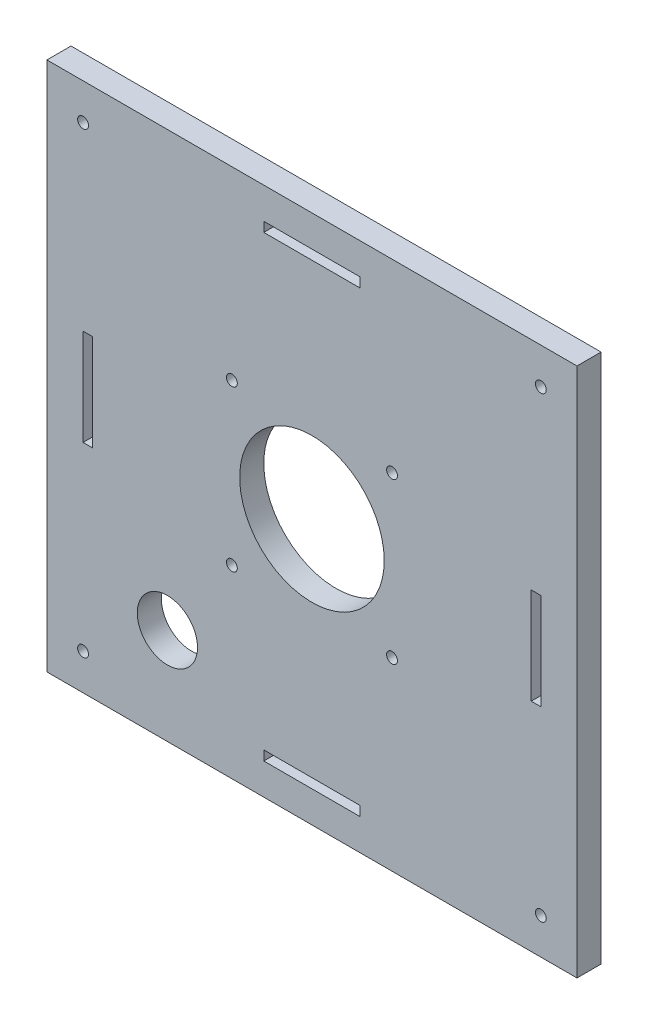
ISO-10303-21;
HEADER;
FILE_DESCRIPTION(('STEP AP214'),'2;1');
FILE_NAME('part.step','',(''),(''),'','','');
FILE_SCHEMA(('AUTOMOTIVE_DESIGN { 1 0 10303 214 1 1 1 1 }'));
ENDSEC;
DATA;
#1=APPLICATION_CONTEXT('core data for automotive mechanical design processes');
#2=APPLICATION_PROTOCOL_DEFINITION('international standard','automotive_design',2000,#1);
#3=PRODUCT_CONTEXT('',#1,'mechanical');
#4=PRODUCT('Part','Part','',(#3));
#5=PRODUCT_RELATED_PRODUCT_CATEGORY('part','',(#4));
#6=PRODUCT_DEFINITION_FORMATION('','',#4);
#7=PRODUCT_DEFINITION_CONTEXT('part definition',#1,'design');
#8=PRODUCT_DEFINITION('design','',#6,#7);
#9=PRODUCT_DEFINITION_SHAPE('','',#8);
#10=(LENGTH_UNIT() NAMED_UNIT(*) SI_UNIT(.MILLI.,.METRE.));
#11=(NAMED_UNIT(*) PLANE_ANGLE_UNIT() SI_UNIT($,.RADIAN.));
#12=(NAMED_UNIT(*) SI_UNIT($,.STERADIAN.) SOLID_ANGLE_UNIT());
#13=UNCERTAINTY_MEASURE_WITH_UNIT(LENGTH_MEASURE(1.E-05),#10,'distance_accuracy_value','');
#14=(GEOMETRIC_REPRESENTATION_CONTEXT(3) GLOBAL_UNCERTAINTY_ASSIGNED_CONTEXT((#13)) GLOBAL_UNIT_ASSIGNED_CONTEXT((#10,
#11,#12)) REPRESENTATION_CONTEXT('',''));
#15=CARTESIAN_POINT('',(0.,0.,0.));
#16=DIRECTION('',(0.,0.,1.));
#17=DIRECTION('',(1.,0.,0.));
#18=AXIS2_PLACEMENT_3D('',#15,#16,#17);
#19=CARTESIAN_POINT('',(110.,-110.,10.));
#20=DIRECTION('',(-1.,0.,0.));
#21=DIRECTION('',(0.,0.,1.));
#22=AXIS2_PLACEMENT_3D('',#19,#20,#21);
#23=PLANE('',#22);
#24=DIRECTION('',(0.,1.,0.));
#25=VECTOR('',#24,1.);
#26=CARTESIAN_POINT('',(110.,-110.,0.));
#27=LINE('',#26,#25);
#28=CARTESIAN_POINT('',(110.,-110.,0.));
#29=VERTEX_POINT('',#28);
#30=CARTESIAN_POINT('',(110.,110.,0.));
#31=VERTEX_POINT('',#30);
#32=EDGE_CURVE('E382',#29,#31,#27,.T.);
#33=ORIENTED_EDGE('',*,*,#32,.T.);
#34=DIRECTION('',(0.,0.,-1.));
#35=VECTOR('',#34,1.);
#36=CARTESIAN_POINT('',(110.,110.,10.));
#37=LINE('',#36,#35);
#38=CARTESIAN_POINT('',(110.,110.,10.));
#39=VERTEX_POINT('',#38);
#40=EDGE_CURVE('E11',#39,#31,#37,.T.);
#41=ORIENTED_EDGE('',*,*,#40,.F.);
#42=DIRECTION('',(0.,1.,0.));
#43=VECTOR('',#42,1.);
#44=CARTESIAN_POINT('',(110.,-110.,10.));
#45=LINE('',#44,#43);
#46=CARTESIAN_POINT('',(110.,-110.,10.));
#47=VERTEX_POINT('',#46);
#48=EDGE_CURVE('E381',#47,#39,#45,.T.);
#49=ORIENTED_EDGE('',*,*,#48,.F.);
#50=DIRECTION('',(0.,0.,-1.));
#51=VECTOR('',#50,1.);
#52=CARTESIAN_POINT('',(110.,-110.,10.));
#53=LINE('',#52,#51);
#54=EDGE_CURVE('E393',#47,#29,#53,.T.);
#55=ORIENTED_EDGE('',*,*,#54,.T.);
#56=EDGE_LOOP('',(#33,#41,#49,#55));
#57=FACE_BOUND('',#56,.T.);
#58=ADVANCED_FACE('F39',(#57),#23,.F.);
#59=CARTESIAN_POINT('',(-110.,110.,10.));
#60=DIRECTION('',(0.,-1.,0.));
#61=DIRECTION('',(0.,0.,-1.));
#62=AXIS2_PLACEMENT_3D('',#59,#60,#61);
#63=PLANE('',#62);
#64=DIRECTION('',(-1.,0.,0.));
#65=VECTOR('',#64,1.);
#66=CARTESIAN_POINT('',(-110.,110.,0.));
#67=LINE('',#66,#65);
#68=CARTESIAN_POINT('',(-110.,110.,0.));
#69=VERTEX_POINT('',#68);
#70=EDGE_CURVE('E397',#31,#69,#67,.T.);
#71=ORIENTED_EDGE('',*,*,#70,.T.);
#72=DIRECTION('',(0.,0.,-1.));
#73=VECTOR('',#72,1.);
#74=CARTESIAN_POINT('',(-110.,110.,10.));
#75=LINE('',#74,#73);
#76=CARTESIAN_POINT('',(-110.,110.,10.));
#77=VERTEX_POINT('',#76);
#78=EDGE_CURVE('E50',#77,#69,#75,.T.);
#79=ORIENTED_EDGE('',*,*,#78,.F.);
#80=DIRECTION('',(-1.,0.,0.));
#81=VECTOR('',#80,1.);
#82=CARTESIAN_POINT('',(-110.,110.,10.));
#83=LINE('',#82,#81);
#84=EDGE_CURVE('E386',#39,#77,#83,.T.);
#85=ORIENTED_EDGE('',*,*,#84,.F.);
#86=ORIENTED_EDGE('',*,*,#40,.T.);
#87=EDGE_LOOP('',(#71,#79,#85,#86));
#88=FACE_BOUND('',#87,.T.);
#89=ADVANCED_FACE('F450',(#88),#63,.F.);
#90=CARTESIAN_POINT('',(-110.,-110.,10.));
#91=DIRECTION('',(1.,0.,0.));
#92=DIRECTION('',(0.,0.,-1.));
#93=AXIS2_PLACEMENT_3D('',#90,#91,#92);
#94=PLANE('',#93);
#95=DIRECTION('',(0.,-1.,0.));
#96=VECTOR('',#95,1.);
#97=CARTESIAN_POINT('',(-110.,-110.,0.));
#98=LINE('',#97,#96);
#99=CARTESIAN_POINT('',(-110.,-110.,0.));
#100=VERTEX_POINT('',#99);
#101=EDGE_CURVE('E398',#69,#100,#98,.T.);
#102=ORIENTED_EDGE('',*,*,#101,.T.);
#103=DIRECTION('',(0.,0.,-1.));
#104=VECTOR('',#103,1.);
#105=CARTESIAN_POINT('',(-110.,-110.,10.));
#106=LINE('',#105,#104);
#107=CARTESIAN_POINT('',(-110.,-110.,10.));
#108=VERTEX_POINT('',#107);
#109=EDGE_CURVE('E404',#108,#100,#106,.T.);
#110=ORIENTED_EDGE('',*,*,#109,.F.);
#111=DIRECTION('',(0.,-1.,0.));
#112=VECTOR('',#111,1.);
#113=CARTESIAN_POINT('',(-110.,-110.,10.));
#114=LINE('',#113,#112);
#115=EDGE_CURVE('E387',#77,#108,#114,.T.);
#116=ORIENTED_EDGE('',*,*,#115,.F.);
#117=ORIENTED_EDGE('',*,*,#78,.T.);
#118=EDGE_LOOP('',(#102,#110,#116,#117));
#119=FACE_BOUND('',#118,.T.);
#120=ADVANCED_FACE('F451',(#119),#94,.F.);
#121=CARTESIAN_POINT('',(-110.,-110.,10.));
#122=DIRECTION('',(0.,1.,0.));
#123=DIRECTION('',(0.,0.,1.));
#124=AXIS2_PLACEMENT_3D('',#121,#122,#123);
#125=PLANE('',#124);
#126=DIRECTION('',(1.,0.,0.));
#127=VECTOR('',#126,1.);
#128=CARTESIAN_POINT('',(-110.,-110.,0.));
#129=LINE('',#128,#127);
#130=EDGE_CURVE('E390',#100,#29,#129,.T.);
#131=ORIENTED_EDGE('',*,*,#130,.T.);
#132=ORIENTED_EDGE('',*,*,#54,.F.);
#133=DIRECTION('',(1.,0.,0.));
#134=VECTOR('',#133,1.);
#135=CARTESIAN_POINT('',(-110.,-110.,10.));
#136=LINE('',#135,#134);
#137=EDGE_CURVE('E391',#108,#47,#136,.T.);
#138=ORIENTED_EDGE('',*,*,#137,.F.);
#139=ORIENTED_EDGE('',*,*,#109,.T.);
#140=EDGE_LOOP('',(#131,#132,#138,#139));
#141=FACE_BOUND('',#140,.T.);
#142=ADVANCED_FACE('F432',(#141),#125,.F.);
#143=CARTESIAN_POINT('',(0.,0.,10.));
#144=DIRECTION('',(0.,0.,-1.));
#145=DIRECTION('',(-1.,0.,0.));
#146=AXIS2_PLACEMENT_3D('',#143,#144,#145);
#147=PLANE('',#146);
#148=DIRECTION('',(-1.,0.,0.));
#149=VECTOR('',#148,1.);
#150=CARTESIAN_POINT('',(-20.0000000000002,-93.,10.));
#151=LINE('',#150,#149);
#152=CARTESIAN_POINT('',(19.9999999999998,-93.,10.));
#153=VERTEX_POINT('',#152);
#154=CARTESIAN_POINT('',(-20.0000000000002,-93.,10.));
#155=VERTEX_POINT('',#154);
#156=EDGE_CURVE('E210',#153,#155,#151,.T.);
#157=ORIENTED_EDGE('',*,*,#156,.F.);
#158=DIRECTION('',(0.,1.,0.));
#159=VECTOR('',#158,1.);
#160=CARTESIAN_POINT('',(19.9999999999998,-97.,10.));
#161=LINE('',#160,#159);
#162=CARTESIAN_POINT('',(19.9999999999998,-97.,10.));
#163=VERTEX_POINT('',#162);
#164=EDGE_CURVE('E54',#163,#153,#161,.T.);
#165=ORIENTED_EDGE('',*,*,#164,.F.);
#166=DIRECTION('',(1.,0.,0.));
#167=VECTOR('',#166,1.);
#168=CARTESIAN_POINT('',(-20.0000000000002,-97.,10.));
#169=LINE('',#168,#167);
#170=CARTESIAN_POINT('',(-20.0000000000002,-97.,10.));
#171=VERTEX_POINT('',#170);
#172=EDGE_CURVE('E200',#171,#163,#169,.T.);
#173=ORIENTED_EDGE('',*,*,#172,.F.);
#174=DIRECTION('',(0.,-1.,0.));
#175=VECTOR('',#174,1.);
#176=CARTESIAN_POINT('',(-20.0000000000002,-97.,10.));
#177=LINE('',#176,#175);
#178=EDGE_CURVE('E201',#155,#171,#177,.T.);
#179=ORIENTED_EDGE('',*,*,#178,.F.);
#180=EDGE_LOOP('',(#157,#165,#173,#179));
#181=FACE_BOUND('',#180,.T.);
#182=DIRECTION('',(0.,-1.,0.));
#183=VECTOR('',#182,1.);
#184=CARTESIAN_POINT('',(-20.0000000000002,97.,10.));
#185=LINE('',#184,#183);
#186=CARTESIAN_POINT('',(-20.0000000000002,97.,10.));
#187=VERTEX_POINT('',#186);
#188=CARTESIAN_POINT('',(-20.0000000000002,93.,10.));
#189=VERTEX_POINT('',#188);
#190=EDGE_CURVE('E234',#187,#189,#185,.T.);
#191=ORIENTED_EDGE('',*,*,#190,.F.);
#192=DIRECTION('',(-1.,0.,0.));
#193=VECTOR('',#192,1.);
#194=CARTESIAN_POINT('',(-20.0000000000002,97.,10.));
#195=LINE('',#194,#193);
#196=CARTESIAN_POINT('',(19.9999999999998,97.,10.));
#197=VERTEX_POINT('',#196);
#198=EDGE_CURVE('E65',#197,#187,#195,.T.);
#199=ORIENTED_EDGE('',*,*,#198,.F.);
#200=DIRECTION('',(0.,1.,0.));
#201=VECTOR('',#200,1.);
#202=CARTESIAN_POINT('',(19.9999999999998,97.,10.));
#203=LINE('',#202,#201);
#204=CARTESIAN_POINT('',(19.9999999999998,93.,10.));
#205=VERTEX_POINT('',#204);
#206=EDGE_CURVE('E227',#205,#197,#203,.T.);
#207=ORIENTED_EDGE('',*,*,#206,.F.);
#208=DIRECTION('',(1.,0.,0.));
#209=VECTOR('',#208,1.);
#210=CARTESIAN_POINT('',(-20.0000000000002,93.,10.));
#211=LINE('',#210,#209);
#212=EDGE_CURVE('E229',#189,#205,#211,.T.);
#213=ORIENTED_EDGE('',*,*,#212,.F.);
#214=EDGE_LOOP('',(#191,#199,#207,#213));
#215=FACE_BOUND('',#214,.T.);
#216=DIRECTION('',(-1.,0.,0.));
#217=VECTOR('',#216,1.);
#218=CARTESIAN_POINT('',(95.,20.0000000000001,10.));
#219=LINE('',#218,#217);
#220=CARTESIAN_POINT('',(95.,20.0000000000001,10.));
#221=VERTEX_POINT('',#220);
#222=CARTESIAN_POINT('',(91.,20.0000000000001,10.));
#223=VERTEX_POINT('',#222);
#224=EDGE_CURVE('E266',#221,#223,#219,.T.);
#225=ORIENTED_EDGE('',*,*,#224,.F.);
#226=DIRECTION('',(0.,1.,0.));
#227=VECTOR('',#226,1.);
#228=CARTESIAN_POINT('',(95.,20.0000000000001,10.));
#229=LINE('',#228,#227);
#230=CARTESIAN_POINT('',(95.,-19.9999999999999,10.));
#231=VERTEX_POINT('',#230);
#232=EDGE_CURVE('E228',#231,#221,#229,.T.);
#233=ORIENTED_EDGE('',*,*,#232,.F.);
#234=DIRECTION('',(1.,0.,0.));
#235=VECTOR('',#234,1.);
#236=CARTESIAN_POINT('',(95.,-19.9999999999999,10.));
#237=LINE('',#236,#235);
#238=CARTESIAN_POINT('',(91.,-19.9999999999999,10.));
#239=VERTEX_POINT('',#238);
#240=EDGE_CURVE('E258',#239,#231,#237,.T.);
#241=ORIENTED_EDGE('',*,*,#240,.F.);
#242=DIRECTION('',(0.,-1.,0.));
#243=VECTOR('',#242,1.);
#244=CARTESIAN_POINT('',(91.,20.0000000000001,10.));
#245=LINE('',#244,#243);
#246=EDGE_CURVE('E261',#223,#239,#245,.T.);
#247=ORIENTED_EDGE('',*,*,#246,.F.);
#248=EDGE_LOOP('',(#225,#233,#241,#247));
#249=FACE_BOUND('',#248,.T.);
#250=DIRECTION('',(-1.,0.,0.));
#251=VECTOR('',#250,1.);
#252=CARTESIAN_POINT('',(-95.,20.0000000000001,10.));
#253=LINE('',#252,#251);
#254=CARTESIAN_POINT('',(-91.,20.0000000000001,10.));
#255=VERTEX_POINT('',#254);
#256=CARTESIAN_POINT('',(-95.,20.0000000000001,10.));
#257=VERTEX_POINT('',#256);
#258=EDGE_CURVE('E300',#255,#257,#253,.T.);
#259=ORIENTED_EDGE('',*,*,#258,.F.);
#260=DIRECTION('',(0.,1.,0.));
#261=VECTOR('',#260,1.);
#262=CARTESIAN_POINT('',(-91.,20.0000000000001,10.));
#263=LINE('',#262,#261);
#264=CARTESIAN_POINT('',(-91.,-19.9999999999999,10.));
#265=VERTEX_POINT('',#264);
#266=EDGE_CURVE('E260',#265,#255,#263,.T.);
#267=ORIENTED_EDGE('',*,*,#266,.F.);
#268=DIRECTION('',(1.,0.,0.));
#269=VECTOR('',#268,1.);
#270=CARTESIAN_POINT('',(-95.,-19.9999999999999,10.));
#271=LINE('',#270,#269);
#272=CARTESIAN_POINT('',(-95.,-19.9999999999999,10.));
#273=VERTEX_POINT('',#272);
#274=EDGE_CURVE('E290',#273,#265,#271,.T.);
#275=ORIENTED_EDGE('',*,*,#274,.F.);
#276=DIRECTION('',(0.,-1.,0.));
#277=VECTOR('',#276,1.);
#278=CARTESIAN_POINT('',(-95.,20.0000000000001,10.));
#279=LINE('',#278,#277);
#280=EDGE_CURVE('E291',#257,#273,#279,.T.);
#281=ORIENTED_EDGE('',*,*,#280,.F.);
#282=EDGE_LOOP('',(#259,#267,#275,#281));
#283=FACE_BOUND('',#282,.T.);
#284=CARTESIAN_POINT('',(-60.,-70.,10.));
#285=DIRECTION('',(0.,0.,1.));
#286=DIRECTION('',(1.,0.,0.));
#287=AXIS2_PLACEMENT_3D('',#284,#285,#286);
#288=CIRCLE('',#287,12.5);
#289=CARTESIAN_POINT('',(-47.5,-70.,10.));
#290=VERTEX_POINT('',#289);
#291=EDGE_CURVE('E311',#290,#290,#288,.T.);
#292=ORIENTED_EDGE('',*,*,#291,.F.);
#293=EDGE_LOOP('',(#292));
#294=FACE_BOUND('',#293,.T.);
#295=CARTESIAN_POINT('',(-95.,95.,10.));
#296=DIRECTION('',(0.,0.,1.));
#297=DIRECTION('',(1.,0.,0.));
#298=AXIS2_PLACEMENT_3D('',#295,#296,#297);
#299=CIRCLE('',#298,2.25);
#300=CARTESIAN_POINT('',(-92.75,95.,10.));
#301=VERTEX_POINT('',#300);
#302=EDGE_CURVE('E326',#301,#301,#299,.T.);
#303=ORIENTED_EDGE('',*,*,#302,.F.);
#304=EDGE_LOOP('',(#303));
#305=FACE_BOUND('',#304,.T.);
#306=CARTESIAN_POINT('',(95.,-95.,10.));
#307=DIRECTION('',(0.,0.,1.));
#308=DIRECTION('',(1.,0.,0.));
#309=AXIS2_PLACEMENT_3D('',#306,#307,#308);
#310=CIRCLE('',#309,2.25);
#311=CARTESIAN_POINT('',(97.25,-95.,10.));
#312=VERTEX_POINT('',#311);
#313=EDGE_CURVE('E318',#312,#312,#310,.T.);
#314=ORIENTED_EDGE('',*,*,#313,.F.);
#315=EDGE_LOOP('',(#314));
#316=FACE_BOUND('',#315,.T.);
#317=CARTESIAN_POINT('',(95.,95.,10.));
#318=DIRECTION('',(0.,0.,1.));
#319=DIRECTION('',(1.,0.,0.));
#320=AXIS2_PLACEMENT_3D('',#317,#318,#319);
#321=CIRCLE('',#320,2.25);
#322=CARTESIAN_POINT('',(97.25,95.,10.));
#323=VERTEX_POINT('',#322);
#324=EDGE_CURVE('E313',#323,#323,#321,.T.);
#325=ORIENTED_EDGE('',*,*,#324,.F.);
#326=EDGE_LOOP('',(#325));
#327=FACE_BOUND('',#326,.T.);
#328=CARTESIAN_POINT('',(-95.,-95.,10.));
#329=DIRECTION('',(0.,0.,1.));
#330=DIRECTION('',(1.,0.,0.));
#331=AXIS2_PLACEMENT_3D('',#328,#329,#330);
#332=CIRCLE('',#331,2.25);
#333=CARTESIAN_POINT('',(-92.75,-95.,10.));
#334=VERTEX_POINT('',#333);
#335=EDGE_CURVE('E335',#334,#334,#332,.T.);
#336=ORIENTED_EDGE('',*,*,#335,.F.);
#337=EDGE_LOOP('',(#336));
#338=FACE_BOUND('',#337,.T.);
#339=CARTESIAN_POINT('',(33.2340187157677,-33.2340187157677,10.));
#340=DIRECTION('',(0.,0.,1.));
#341=DIRECTION('',(1.,0.,0.));
#342=AXIS2_PLACEMENT_3D('',#339,#340,#341);
#343=CIRCLE('',#342,2.25);
#344=CARTESIAN_POINT('',(35.4840187157677,-33.2340187157677,10.));
#345=VERTEX_POINT('',#344);
#346=EDGE_CURVE('E375',#345,#345,#343,.T.);
#347=ORIENTED_EDGE('',*,*,#346,.F.);
#348=EDGE_LOOP('',(#347));
#349=FACE_BOUND('',#348,.T.);
#350=CARTESIAN_POINT('',(-33.2340187157677,-33.2340187157677,10.));
#351=DIRECTION('',(0.,0.,1.));
#352=DIRECTION('',(1.,0.,0.));
#353=AXIS2_PLACEMENT_3D('',#350,#351,#352);
#354=CIRCLE('',#353,2.25);
#355=CARTESIAN_POINT('',(-30.9840187157677,-33.2340187157677,10.));
#356=VERTEX_POINT('',#355);
#357=EDGE_CURVE('E367',#356,#356,#354,.T.);
#358=ORIENTED_EDGE('',*,*,#357,.F.);
#359=EDGE_LOOP('',(#358));
#360=FACE_BOUND('',#359,.T.);
#361=CARTESIAN_POINT('',(-33.2340187157677,33.2340187157677,10.));
#362=DIRECTION('',(0.,0.,1.));
#363=DIRECTION('',(1.,0.,0.));
#364=AXIS2_PLACEMENT_3D('',#361,#362,#363);
#365=CIRCLE('',#364,2.25);
#366=CARTESIAN_POINT('',(-30.9840187157677,33.2340187157677,10.));
#367=VERTEX_POINT('',#366);
#368=EDGE_CURVE('E362',#367,#367,#365,.T.);
#369=ORIENTED_EDGE('',*,*,#368,.F.);
#370=EDGE_LOOP('',(#369));
#371=FACE_BOUND('',#370,.T.);
#372=CARTESIAN_POINT('',(33.2340187157677,33.2340187157677,10.));
#373=DIRECTION('',(0.,0.,1.));
#374=DIRECTION('',(1.,0.,0.));
#375=AXIS2_PLACEMENT_3D('',#372,#373,#374);
#376=CIRCLE('',#375,2.25);
#377=CARTESIAN_POINT('',(35.4840187157677,33.2340187157677,10.));
#378=VERTEX_POINT('',#377);
#379=EDGE_CURVE('E368',#378,#378,#376,.T.);
#380=ORIENTED_EDGE('',*,*,#379,.F.);
#381=EDGE_LOOP('',(#380));
#382=FACE_BOUND('',#381,.T.);
#383=CARTESIAN_POINT('',(0.,0.,10.));
#384=DIRECTION('',(0.,0.,1.));
#385=DIRECTION('',(1.,0.,0.));
#386=AXIS2_PLACEMENT_3D('',#383,#384,#385);
#387=CIRCLE('',#386,30.);
#388=CARTESIAN_POINT('',(30.,0.,10.));
#389=VERTEX_POINT('',#388);
#390=EDGE_CURVE('E377',#389,#389,#387,.T.);
#391=ORIENTED_EDGE('',*,*,#390,.F.);
#392=EDGE_LOOP('',(#391));
#393=FACE_BOUND('',#392,.T.);
#394=ORIENTED_EDGE('',*,*,#48,.T.);
#395=ORIENTED_EDGE('',*,*,#84,.T.);
#396=ORIENTED_EDGE('',*,*,#115,.T.);
#397=ORIENTED_EDGE('',*,*,#137,.T.);
#398=EDGE_LOOP('',(#394,#395,#396,#397));
#399=FACE_BOUND('',#398,.T.);
#400=ADVANCED_FACE('F431',(#181,#215,#249,#283,#294,#305,#316,#327,#338,#349,#360,#371,#382,
#393,#399),#147,.F.);
#401=CARTESIAN_POINT('',(0.,0.,0.));
#402=DIRECTION('',(0.,0.,-1.));
#403=DIRECTION('',(-1.,0.,0.));
#404=AXIS2_PLACEMENT_3D('',#401,#402,#403);
#405=PLANE('',#404);
#406=DIRECTION('',(0.,1.,0.));
#407=VECTOR('',#406,1.);
#408=CARTESIAN_POINT('',(19.9999999999998,-97.,0.));
#409=LINE('',#408,#407);
#410=CARTESIAN_POINT('',(19.9999999999998,-97.,0.));
#411=VERTEX_POINT('',#410);
#412=CARTESIAN_POINT('',(19.9999999999998,-93.,0.));
#413=VERTEX_POINT('',#412);
#414=EDGE_CURVE('E177',#411,#413,#409,.T.);
#415=ORIENTED_EDGE('',*,*,#414,.T.);
#416=DIRECTION('',(-1.,0.,0.));
#417=VECTOR('',#416,1.);
#418=CARTESIAN_POINT('',(-20.0000000000002,-93.,0.));
#419=LINE('',#418,#417);
#420=CARTESIAN_POINT('',(-20.0000000000002,-93.,0.));
#421=VERTEX_POINT('',#420);
#422=EDGE_CURVE('E186',#413,#421,#419,.T.);
#423=ORIENTED_EDGE('',*,*,#422,.T.);
#424=DIRECTION('',(0.,-1.,0.));
#425=VECTOR('',#424,1.);
#426=CARTESIAN_POINT('',(-20.0000000000002,-97.,0.));
#427=LINE('',#426,#425);
#428=CARTESIAN_POINT('',(-20.0000000000002,-97.,0.));
#429=VERTEX_POINT('',#428);
#430=EDGE_CURVE('E195',#421,#429,#427,.T.);
#431=ORIENTED_EDGE('',*,*,#430,.T.);
#432=DIRECTION('',(1.,0.,0.));
#433=VECTOR('',#432,1.);
#434=CARTESIAN_POINT('',(-20.0000000000002,-97.,0.));
#435=LINE('',#434,#433);
#436=EDGE_CURVE('E184',#429,#411,#435,.T.);
#437=ORIENTED_EDGE('',*,*,#436,.T.);
#438=EDGE_LOOP('',(#415,#423,#431,#437));
#439=FACE_BOUND('',#438,.T.);
#440=DIRECTION('',(-1.,0.,0.));
#441=VECTOR('',#440,1.);
#442=CARTESIAN_POINT('',(-20.0000000000002,97.,0.));
#443=LINE('',#442,#441);
#444=CARTESIAN_POINT('',(19.9999999999998,97.,0.));
#445=VERTEX_POINT('',#444);
#446=CARTESIAN_POINT('',(-20.0000000000002,97.,0.));
#447=VERTEX_POINT('',#446);
#448=EDGE_CURVE('E233',#445,#447,#443,.T.);
#449=ORIENTED_EDGE('',*,*,#448,.T.);
#450=DIRECTION('',(0.,-1.,0.));
#451=VECTOR('',#450,1.);
#452=CARTESIAN_POINT('',(-20.0000000000002,97.,0.));
#453=LINE('',#452,#451);
#454=CARTESIAN_POINT('',(-20.0000000000002,93.,0.));
#455=VERTEX_POINT('',#454);
#456=EDGE_CURVE('E243',#447,#455,#453,.T.);
#457=ORIENTED_EDGE('',*,*,#456,.T.);
#458=DIRECTION('',(1.,0.,0.));
#459=VECTOR('',#458,1.);
#460=CARTESIAN_POINT('',(-20.0000000000002,93.,0.));
#461=LINE('',#460,#459);
#462=CARTESIAN_POINT('',(19.9999999999998,93.,0.));
#463=VERTEX_POINT('',#462);
#464=EDGE_CURVE('E239',#455,#463,#461,.T.);
#465=ORIENTED_EDGE('',*,*,#464,.T.);
#466=DIRECTION('',(0.,1.,0.));
#467=VECTOR('',#466,1.);
#468=CARTESIAN_POINT('',(19.9999999999998,97.,0.));
#469=LINE('',#468,#467);
#470=EDGE_CURVE('E218',#463,#445,#469,.T.);
#471=ORIENTED_EDGE('',*,*,#470,.T.);
#472=EDGE_LOOP('',(#449,#457,#465,#471));
#473=FACE_BOUND('',#472,.T.);
#474=DIRECTION('',(0.,1.,0.));
#475=VECTOR('',#474,1.);
#476=CARTESIAN_POINT('',(95.,20.0000000000001,0.));
#477=LINE('',#476,#475);
#478=CARTESIAN_POINT('',(95.,-19.9999999999999,0.));
#479=VERTEX_POINT('',#478);
#480=CARTESIAN_POINT('',(95.,20.0000000000001,0.));
#481=VERTEX_POINT('',#480);
#482=EDGE_CURVE('E265',#479,#481,#477,.T.);
#483=ORIENTED_EDGE('',*,*,#482,.T.);
#484=DIRECTION('',(-1.,0.,0.));
#485=VECTOR('',#484,1.);
#486=CARTESIAN_POINT('',(95.,20.0000000000001,0.));
#487=LINE('',#486,#485);
#488=CARTESIAN_POINT('',(91.,20.0000000000001,0.));
#489=VERTEX_POINT('',#488);
#490=EDGE_CURVE('E273',#481,#489,#487,.T.);
#491=ORIENTED_EDGE('',*,*,#490,.T.);
#492=DIRECTION('',(0.,-1.,0.));
#493=VECTOR('',#492,1.);
#494=CARTESIAN_POINT('',(91.,20.0000000000001,0.));
#495=LINE('',#494,#493);
#496=CARTESIAN_POINT('',(91.,-19.9999999999999,0.));
#497=VERTEX_POINT('',#496);
#498=EDGE_CURVE('E275',#489,#497,#495,.T.);
#499=ORIENTED_EDGE('',*,*,#498,.T.);
#500=DIRECTION('',(1.,0.,0.));
#501=VECTOR('',#500,1.);
#502=CARTESIAN_POINT('',(95.,-19.9999999999999,0.));
#503=LINE('',#502,#501);
#504=EDGE_CURVE('E252',#497,#479,#503,.T.);
#505=ORIENTED_EDGE('',*,*,#504,.T.);
#506=EDGE_LOOP('',(#483,#491,#499,#505));
#507=FACE_BOUND('',#506,.T.);
#508=DIRECTION('',(0.,1.,0.));
#509=VECTOR('',#508,1.);
#510=CARTESIAN_POINT('',(-91.,20.0000000000001,0.));
#511=LINE('',#510,#509);
#512=CARTESIAN_POINT('',(-91.,-19.9999999999999,0.));
#513=VERTEX_POINT('',#512);
#514=CARTESIAN_POINT('',(-91.,20.0000000000001,0.));
#515=VERTEX_POINT('',#514);
#516=EDGE_CURVE('E295',#513,#515,#511,.T.);
#517=ORIENTED_EDGE('',*,*,#516,.T.);
#518=DIRECTION('',(-1.,0.,0.));
#519=VECTOR('',#518,1.);
#520=CARTESIAN_POINT('',(-95.,20.0000000000001,0.));
#521=LINE('',#520,#519);
#522=CARTESIAN_POINT('',(-95.,20.0000000000001,0.));
#523=VERTEX_POINT('',#522);
#524=EDGE_CURVE('E306',#515,#523,#521,.T.);
#525=ORIENTED_EDGE('',*,*,#524,.T.);
#526=DIRECTION('',(0.,-1.,0.));
#527=VECTOR('',#526,1.);
#528=CARTESIAN_POINT('',(-95.,20.0000000000001,0.));
#529=LINE('',#528,#527);
#530=CARTESIAN_POINT('',(-95.,-19.9999999999999,0.));
#531=VERTEX_POINT('',#530);
#532=EDGE_CURVE('E303',#523,#531,#529,.T.);
#533=ORIENTED_EDGE('',*,*,#532,.T.);
#534=DIRECTION('',(1.,0.,0.));
#535=VECTOR('',#534,1.);
#536=CARTESIAN_POINT('',(-95.,-19.9999999999999,0.));
#537=LINE('',#536,#535);
#538=EDGE_CURVE('E285',#531,#513,#537,.T.);
#539=ORIENTED_EDGE('',*,*,#538,.T.);
#540=EDGE_LOOP('',(#517,#525,#533,#539));
#541=FACE_BOUND('',#540,.T.);
#542=CARTESIAN_POINT('',(-60.,-70.,0.));
#543=DIRECTION('',(0.,0.,1.));
#544=DIRECTION('',(1.,0.,0.));
#545=AXIS2_PLACEMENT_3D('',#542,#543,#544);
#546=CIRCLE('',#545,12.5);
#547=CARTESIAN_POINT('',(-47.5,-70.,0.));
#548=VERTEX_POINT('',#547);
#549=EDGE_CURVE('E215',#548,#548,#546,.T.);
#550=ORIENTED_EDGE('',*,*,#549,.T.);
#551=EDGE_LOOP('',(#550));
#552=FACE_BOUND('',#551,.T.);
#553=CARTESIAN_POINT('',(-95.,95.,0.));
#554=DIRECTION('',(0.,0.,1.));
#555=DIRECTION('',(1.,0.,0.));
#556=AXIS2_PLACEMENT_3D('',#553,#554,#555);
#557=CIRCLE('',#556,2.25);
#558=CARTESIAN_POINT('',(-92.75,95.,0.));
#559=VERTEX_POINT('',#558);
#560=EDGE_CURVE('E325',#559,#559,#557,.T.);
#561=ORIENTED_EDGE('',*,*,#560,.T.);
#562=EDGE_LOOP('',(#561));
#563=FACE_BOUND('',#562,.T.);
#564=CARTESIAN_POINT('',(95.,-95.,0.));
#565=DIRECTION('',(0.,0.,1.));
#566=DIRECTION('',(1.,0.,0.));
#567=AXIS2_PLACEMENT_3D('',#564,#565,#566);
#568=CIRCLE('',#567,2.25);
#569=CARTESIAN_POINT('',(97.25,-95.,0.));
#570=VERTEX_POINT('',#569);
#571=EDGE_CURVE('E327',#570,#570,#568,.T.);
#572=ORIENTED_EDGE('',*,*,#571,.T.);
#573=EDGE_LOOP('',(#572));
#574=FACE_BOUND('',#573,.T.);
#575=CARTESIAN_POINT('',(95.,95.,0.));
#576=DIRECTION('',(0.,0.,1.));
#577=DIRECTION('',(1.,0.,0.));
#578=AXIS2_PLACEMENT_3D('',#575,#576,#577);
#579=CIRCLE('',#578,2.25);
#580=CARTESIAN_POINT('',(97.25,95.,0.));
#581=VERTEX_POINT('',#580);
#582=EDGE_CURVE('E320',#581,#581,#579,.T.);
#583=ORIENTED_EDGE('',*,*,#582,.T.);
#584=EDGE_LOOP('',(#583));
#585=FACE_BOUND('',#584,.T.);
#586=CARTESIAN_POINT('',(-95.,-95.,0.));
#587=DIRECTION('',(0.,0.,1.));
#588=DIRECTION('',(1.,0.,0.));
#589=AXIS2_PLACEMENT_3D('',#586,#587,#588);
#590=CIRCLE('',#589,2.25);
#591=CARTESIAN_POINT('',(-92.75,-95.,0.));
#592=VERTEX_POINT('',#591);
#593=EDGE_CURVE('E329',#592,#592,#590,.T.);
#594=ORIENTED_EDGE('',*,*,#593,.T.);
#595=EDGE_LOOP('',(#594));
#596=FACE_BOUND('',#595,.T.);
#597=CARTESIAN_POINT('',(33.2340187157677,-33.2340187157677,0.));
#598=DIRECTION('',(0.,0.,1.));
#599=DIRECTION('',(1.,0.,0.));
#600=AXIS2_PLACEMENT_3D('',#597,#598,#599);
#601=CIRCLE('',#600,4.);
#602=CARTESIAN_POINT('',(37.2340187157677,-33.2340187157677,0.));
#603=VERTEX_POINT('',#602);
#604=EDGE_CURVE('E353',#603,#603,#601,.T.);
#605=ORIENTED_EDGE('',*,*,#604,.T.);
#606=EDGE_LOOP('',(#605));
#607=FACE_BOUND('',#606,.T.);
#608=CARTESIAN_POINT('',(-33.2340187157677,-33.2340187157677,0.));
#609=DIRECTION('',(0.,0.,1.));
#610=DIRECTION('',(1.,0.,0.));
#611=AXIS2_PLACEMENT_3D('',#608,#609,#610);
#612=CIRCLE('',#611,4.);
#613=CARTESIAN_POINT('',(-29.2340187157677,-33.2340187157677,0.));
#614=VERTEX_POINT('',#613);
#615=EDGE_CURVE('E350',#614,#614,#612,.T.);
#616=ORIENTED_EDGE('',*,*,#615,.T.);
#617=EDGE_LOOP('',(#616));
#618=FACE_BOUND('',#617,.T.);
#619=CARTESIAN_POINT('',(-33.2340187157677,33.2340187157677,0.));
#620=DIRECTION('',(0.,0.,1.));
#621=DIRECTION('',(1.,0.,0.));
#622=AXIS2_PLACEMENT_3D('',#619,#620,#621);
#623=CIRCLE('',#622,4.);
#624=CARTESIAN_POINT('',(-29.2340187157677,33.2340187157677,0.));
#625=VERTEX_POINT('',#624);
#626=EDGE_CURVE('E344',#625,#625,#623,.T.);
#627=ORIENTED_EDGE('',*,*,#626,.T.);
#628=EDGE_LOOP('',(#627));
#629=FACE_BOUND('',#628,.T.);
#630=CARTESIAN_POINT('',(33.2340187157677,33.2340187157677,0.));
#631=DIRECTION('',(0.,0.,1.));
#632=DIRECTION('',(1.,0.,0.));
#633=AXIS2_PLACEMENT_3D('',#630,#631,#632);
#634=CIRCLE('',#633,4.);
#635=CARTESIAN_POINT('',(37.2340187157677,33.2340187157677,0.));
#636=VERTEX_POINT('',#635);
#637=EDGE_CURVE('E343',#636,#636,#634,.T.);
#638=ORIENTED_EDGE('',*,*,#637,.T.);
#639=EDGE_LOOP('',(#638));
#640=FACE_BOUND('',#639,.T.);
#641=CARTESIAN_POINT('',(0.,0.,0.));
#642=DIRECTION('',(0.,0.,1.));
#643=DIRECTION('',(1.,0.,0.));
#644=AXIS2_PLACEMENT_3D('',#641,#642,#643);
#645=CIRCLE('',#644,30.);
#646=CARTESIAN_POINT('',(30.,0.,0.));
#647=VERTEX_POINT('',#646);
#648=EDGE_CURVE('E380',#647,#647,#645,.T.);
#649=ORIENTED_EDGE('',*,*,#648,.T.);
#650=EDGE_LOOP('',(#649));
#651=FACE_BOUND('',#650,.T.);
#652=ORIENTED_EDGE('',*,*,#32,.F.);
#653=ORIENTED_EDGE('',*,*,#130,.F.);
#654=ORIENTED_EDGE('',*,*,#101,.F.);
#655=ORIENTED_EDGE('',*,*,#70,.F.);
#656=EDGE_LOOP('',(#652,#653,#654,#655));
#657=FACE_BOUND('',#656,.T.);
#658=ADVANCED_FACE('F192',(#439,#473,#507,#541,#552,#563,#574,#585,#596,#607,#618,#629,#640,
#651,#657),#405,.T.);
#659=CARTESIAN_POINT('',(0.,0.,10.));
#660=DIRECTION('',(0.,0.,-1.));
#661=DIRECTION('',(-1.,0.,0.));
#662=AXIS2_PLACEMENT_3D('',#659,#660,#661);
#663=CYLINDRICAL_SURFACE('',#662,30.);
#664=ORIENTED_EDGE('',*,*,#390,.T.);
#665=EDGE_LOOP('',(#664));
#666=FACE_BOUND('',#665,.T.);
#667=ORIENTED_EDGE('',*,*,#648,.F.);
#668=EDGE_LOOP('',(#667));
#669=FACE_BOUND('',#668,.T.);
#670=ADVANCED_FACE('F430',(#666,#669),#663,.F.);
#671=CARTESIAN_POINT('',(33.2340187157677,33.2340187157677,10.));
#672=DIRECTION('',(0.,0.,-1.));
#673=DIRECTION('',(-1.,0.,0.));
#674=AXIS2_PLACEMENT_3D('',#671,#672,#673);
#675=CYLINDRICAL_SURFACE('',#674,2.25);
#676=CARTESIAN_POINT('',(33.2340187157677,33.2340187157677,4.5));
#677=DIRECTION('',(0.,0.,1.));
#678=DIRECTION('',(1.,0.,0.));
#679=AXIS2_PLACEMENT_3D('',#676,#677,#678);
#680=CIRCLE('',#679,2.25);
#681=CARTESIAN_POINT('',(35.4840187157677,33.2340187157677,4.5));
#682=VERTEX_POINT('',#681);
#683=EDGE_CURVE('E45',#682,#682,#680,.T.);
#684=ORIENTED_EDGE('',*,*,#683,.F.);
#685=EDGE_LOOP('',(#684));
#686=FACE_BOUND('',#685,.T.);
#687=ORIENTED_EDGE('',*,*,#379,.T.);
#688=EDGE_LOOP('',(#687));
#689=FACE_BOUND('',#688,.T.);
#690=ADVANCED_FACE('F421',(#686,#689),#675,.F.);
#691=CARTESIAN_POINT('',(-33.2340187157677,33.2340187157677,10.));
#692=DIRECTION('',(0.,0.,-1.));
#693=DIRECTION('',(-1.,0.,0.));
#694=AXIS2_PLACEMENT_3D('',#691,#692,#693);
#695=CYLINDRICAL_SURFACE('',#694,2.25);
#696=CARTESIAN_POINT('',(-33.2340187157677,33.2340187157677,4.5));
#697=DIRECTION('',(0.,0.,1.));
#698=DIRECTION('',(1.,0.,0.));
#699=AXIS2_PLACEMENT_3D('',#696,#697,#698);
#700=CIRCLE('',#699,2.25);
#701=CARTESIAN_POINT('',(-30.9840187157677,33.2340187157677,4.5));
#702=VERTEX_POINT('',#701);
#703=EDGE_CURVE('E415',#702,#702,#700,.T.);
#704=ORIENTED_EDGE('',*,*,#703,.F.);
#705=EDGE_LOOP('',(#704));
#706=FACE_BOUND('',#705,.T.);
#707=ORIENTED_EDGE('',*,*,#368,.T.);
#708=EDGE_LOOP('',(#707));
#709=FACE_BOUND('',#708,.T.);
#710=ADVANCED_FACE('F428',(#706,#709),#695,.F.);
#711=CARTESIAN_POINT('',(-33.2340187157677,-33.2340187157677,10.));
#712=DIRECTION('',(0.,0.,-1.));
#713=DIRECTION('',(-1.,0.,0.));
#714=AXIS2_PLACEMENT_3D('',#711,#712,#713);
#715=CYLINDRICAL_SURFACE('',#714,2.25);
#716=CARTESIAN_POINT('',(-33.2340187157677,-33.2340187157677,4.5));
#717=DIRECTION('',(0.,0.,1.));
#718=DIRECTION('',(1.,0.,0.));
#719=AXIS2_PLACEMENT_3D('',#716,#717,#718);
#720=CIRCLE('',#719,2.25);
#721=CARTESIAN_POINT('',(-30.9840187157677,-33.2340187157677,4.5));
#722=VERTEX_POINT('',#721);
#723=EDGE_CURVE('E414',#722,#722,#720,.T.);
#724=ORIENTED_EDGE('',*,*,#723,.F.);
#725=EDGE_LOOP('',(#724));
#726=FACE_BOUND('',#725,.T.);
#727=ORIENTED_EDGE('',*,*,#357,.T.);
#728=EDGE_LOOP('',(#727));
#729=FACE_BOUND('',#728,.T.);
#730=ADVANCED_FACE('F496',(#726,#729),#715,.F.);
#731=CARTESIAN_POINT('',(33.2340187157677,-33.2340187157677,10.));
#732=DIRECTION('',(0.,0.,-1.));
#733=DIRECTION('',(-1.,0.,0.));
#734=AXIS2_PLACEMENT_3D('',#731,#732,#733);
#735=CYLINDRICAL_SURFACE('',#734,2.25);
#736=CARTESIAN_POINT('',(33.2340187157677,-33.2340187157677,4.5));
#737=DIRECTION('',(0.,0.,1.));
#738=DIRECTION('',(1.,0.,0.));
#739=AXIS2_PLACEMENT_3D('',#736,#737,#738);
#740=CIRCLE('',#739,2.25);
#741=CARTESIAN_POINT('',(35.4840187157677,-33.2340187157677,4.5));
#742=VERTEX_POINT('',#741);
#743=EDGE_CURVE('E365',#742,#742,#740,.T.);
#744=ORIENTED_EDGE('',*,*,#743,.F.);
#745=EDGE_LOOP('',(#744));
#746=FACE_BOUND('',#745,.T.);
#747=ORIENTED_EDGE('',*,*,#346,.T.);
#748=EDGE_LOOP('',(#747));
#749=FACE_BOUND('',#748,.T.);
#750=ADVANCED_FACE('F504',(#746,#749),#735,.F.);
#751=CARTESIAN_POINT('',(33.2340187157677,-33.2340187157677,4.5));
#752=DIRECTION('',(0.,0.,-1.));
#753=DIRECTION('',(-1.,0.,0.));
#754=AXIS2_PLACEMENT_3D('',#751,#752,#753);
#755=CYLINDRICAL_SURFACE('',#754,4.);
#756=CARTESIAN_POINT('',(33.2340187157677,-33.2340187157677,4.5));
#757=DIRECTION('',(0.,0.,1.));
#758=DIRECTION('',(1.,0.,0.));
#759=AXIS2_PLACEMENT_3D('',#756,#757,#758);
#760=CIRCLE('',#759,4.);
#761=CARTESIAN_POINT('',(37.2340187157677,-33.2340187157677,4.5));
#762=VERTEX_POINT('',#761);
#763=EDGE_CURVE('E336',#762,#762,#760,.T.);
#764=ORIENTED_EDGE('',*,*,#763,.T.);
#765=EDGE_LOOP('',(#764));
#766=FACE_BOUND('',#765,.T.);
#767=ORIENTED_EDGE('',*,*,#604,.F.);
#768=EDGE_LOOP('',(#767));
#769=FACE_BOUND('',#768,.T.);
#770=ADVANCED_FACE('F511',(#766,#769),#755,.F.);
#771=CARTESIAN_POINT('',(33.2340187157677,-33.2340187157677,4.5));
#772=DIRECTION('',(0.,0.,1.));
#773=DIRECTION('',(1.,0.,0.));
#774=AXIS2_PLACEMENT_3D('',#771,#772,#773);
#775=PLANE('',#774);
#776=ORIENTED_EDGE('',*,*,#743,.T.);
#777=EDGE_LOOP('',(#776));
#778=FACE_BOUND('',#777,.T.);
#779=ORIENTED_EDGE('',*,*,#763,.F.);
#780=EDGE_LOOP('',(#779));
#781=FACE_BOUND('',#780,.T.);
#782=ADVANCED_FACE('F525',(#778,#781),#775,.F.);
#783=CARTESIAN_POINT('',(-33.2340187157677,-33.2340187157677,4.5));
#784=DIRECTION('',(0.,0.,-1.));
#785=DIRECTION('',(-1.,0.,0.));
#786=AXIS2_PLACEMENT_3D('',#783,#784,#785);
#787=CYLINDRICAL_SURFACE('',#786,4.);
#788=CARTESIAN_POINT('',(-33.2340187157677,-33.2340187157677,4.5));
#789=DIRECTION('',(0.,0.,1.));
#790=DIRECTION('',(1.,0.,0.));
#791=AXIS2_PLACEMENT_3D('',#788,#789,#790);
#792=CIRCLE('',#791,4.);
#793=CARTESIAN_POINT('',(-29.2340187157677,-33.2340187157677,4.5));
#794=VERTEX_POINT('',#793);
#795=EDGE_CURVE('E351',#794,#794,#792,.T.);
#796=ORIENTED_EDGE('',*,*,#795,.T.);
#797=EDGE_LOOP('',(#796));
#798=FACE_BOUND('',#797,.T.);
#799=ORIENTED_EDGE('',*,*,#615,.F.);
#800=EDGE_LOOP('',(#799));
#801=FACE_BOUND('',#800,.T.);
#802=ADVANCED_FACE('F535',(#798,#801),#787,.F.);
#803=CARTESIAN_POINT('',(-33.2340187157677,-33.2340187157677,4.5));
#804=DIRECTION('',(0.,0.,1.));
#805=DIRECTION('',(1.,0.,0.));
#806=AXIS2_PLACEMENT_3D('',#803,#804,#805);
#807=PLANE('',#806);
#808=ORIENTED_EDGE('',*,*,#723,.T.);
#809=EDGE_LOOP('',(#808));
#810=FACE_BOUND('',#809,.T.);
#811=ORIENTED_EDGE('',*,*,#795,.F.);
#812=EDGE_LOOP('',(#811));
#813=FACE_BOUND('',#812,.T.);
#814=ADVANCED_FACE('F544',(#810,#813),#807,.F.);
#815=CARTESIAN_POINT('',(-33.2340187157677,33.2340187157677,4.5));
#816=DIRECTION('',(0.,0.,-1.));
#817=DIRECTION('',(-1.,0.,0.));
#818=AXIS2_PLACEMENT_3D('',#815,#816,#817);
#819=CYLINDRICAL_SURFACE('',#818,4.);
#820=CARTESIAN_POINT('',(-33.2340187157677,33.2340187157677,4.5));
#821=DIRECTION('',(0.,0.,1.));
#822=DIRECTION('',(1.,0.,0.));
#823=AXIS2_PLACEMENT_3D('',#820,#821,#822);
#824=CIRCLE('',#823,4.);
#825=CARTESIAN_POINT('',(-29.2340187157677,33.2340187157677,4.5));
#826=VERTEX_POINT('',#825);
#827=EDGE_CURVE('E342',#826,#826,#824,.T.);
#828=ORIENTED_EDGE('',*,*,#827,.T.);
#829=EDGE_LOOP('',(#828));
#830=FACE_BOUND('',#829,.T.);
#831=ORIENTED_EDGE('',*,*,#626,.F.);
#832=EDGE_LOOP('',(#831));
#833=FACE_BOUND('',#832,.T.);
#834=ADVANCED_FACE('F550',(#830,#833),#819,.F.);
#835=CARTESIAN_POINT('',(-33.2340187157677,33.2340187157677,4.5));
#836=DIRECTION('',(0.,0.,1.));
#837=DIRECTION('',(1.,0.,0.));
#838=AXIS2_PLACEMENT_3D('',#835,#836,#837);
#839=PLANE('',#838);
#840=ORIENTED_EDGE('',*,*,#703,.T.);
#841=EDGE_LOOP('',(#840));
#842=FACE_BOUND('',#841,.T.);
#843=ORIENTED_EDGE('',*,*,#827,.F.);
#844=EDGE_LOOP('',(#843));
#845=FACE_BOUND('',#844,.T.);
#846=ADVANCED_FACE('F559',(#842,#845),#839,.F.);
#847=CARTESIAN_POINT('',(33.2340187157677,33.2340187157677,4.5));
#848=DIRECTION('',(0.,0.,-1.));
#849=DIRECTION('',(-1.,0.,0.));
#850=AXIS2_PLACEMENT_3D('',#847,#848,#849);
#851=CYLINDRICAL_SURFACE('',#850,4.);
#852=CARTESIAN_POINT('',(33.2340187157677,33.2340187157677,4.5));
#853=DIRECTION('',(0.,0.,1.));
#854=DIRECTION('',(1.,0.,0.));
#855=AXIS2_PLACEMENT_3D('',#852,#853,#854);
#856=CIRCLE('',#855,4.);
#857=CARTESIAN_POINT('',(37.2340187157677,33.2340187157677,4.5));
#858=VERTEX_POINT('',#857);
#859=EDGE_CURVE('E360',#858,#858,#856,.T.);
#860=ORIENTED_EDGE('',*,*,#859,.T.);
#861=EDGE_LOOP('',(#860));
#862=FACE_BOUND('',#861,.T.);
#863=ORIENTED_EDGE('',*,*,#637,.F.);
#864=EDGE_LOOP('',(#863));
#865=FACE_BOUND('',#864,.T.);
#866=ADVANCED_FACE('F568',(#862,#865),#851,.F.);
#867=CARTESIAN_POINT('',(33.2340187157677,33.2340187157677,4.5));
#868=DIRECTION('',(0.,0.,1.));
#869=DIRECTION('',(1.,0.,0.));
#870=AXIS2_PLACEMENT_3D('',#867,#868,#869);
#871=PLANE('',#870);
#872=ORIENTED_EDGE('',*,*,#683,.T.);
#873=EDGE_LOOP('',(#872));
#874=FACE_BOUND('',#873,.T.);
#875=ORIENTED_EDGE('',*,*,#859,.F.);
#876=EDGE_LOOP('',(#875));
#877=FACE_BOUND('',#876,.T.);
#878=ADVANCED_FACE('F420',(#874,#877),#871,.F.);
#879=CARTESIAN_POINT('',(-95.,-95.,10.));
#880=DIRECTION('',(0.,0.,-1.));
#881=DIRECTION('',(-1.,0.,0.));
#882=AXIS2_PLACEMENT_3D('',#879,#880,#881);
#883=CYLINDRICAL_SURFACE('',#882,2.25);
#884=ORIENTED_EDGE('',*,*,#335,.T.);
#885=EDGE_LOOP('',(#884));
#886=FACE_BOUND('',#885,.T.);
#887=ORIENTED_EDGE('',*,*,#593,.F.);
#888=EDGE_LOOP('',(#887));
#889=FACE_BOUND('',#888,.T.);
#890=ADVANCED_FACE('F583',(#886,#889),#883,.F.);
#891=CARTESIAN_POINT('',(95.,95.,10.));
#892=DIRECTION('',(0.,0.,-1.));
#893=DIRECTION('',(-1.,0.,0.));
#894=AXIS2_PLACEMENT_3D('',#891,#892,#893);
#895=CYLINDRICAL_SURFACE('',#894,2.25);
#896=ORIENTED_EDGE('',*,*,#324,.T.);
#897=EDGE_LOOP('',(#896));
#898=FACE_BOUND('',#897,.T.);
#899=ORIENTED_EDGE('',*,*,#582,.F.);
#900=EDGE_LOOP('',(#899));
#901=FACE_BOUND('',#900,.T.);
#902=ADVANCED_FACE('F592',(#898,#901),#895,.F.);
#903=CARTESIAN_POINT('',(95.,-95.,10.));
#904=DIRECTION('',(0.,0.,-1.));
#905=DIRECTION('',(-1.,0.,0.));
#906=AXIS2_PLACEMENT_3D('',#903,#904,#905);
#907=CYLINDRICAL_SURFACE('',#906,2.25);
#908=ORIENTED_EDGE('',*,*,#313,.T.);
#909=EDGE_LOOP('',(#908));
#910=FACE_BOUND('',#909,.T.);
#911=ORIENTED_EDGE('',*,*,#571,.F.);
#912=EDGE_LOOP('',(#911));
#913=FACE_BOUND('',#912,.T.);
#914=ADVANCED_FACE('F604',(#910,#913),#907,.F.);
#915=CARTESIAN_POINT('',(-95.,95.,10.));
#916=DIRECTION('',(0.,0.,-1.));
#917=DIRECTION('',(-1.,0.,0.));
#918=AXIS2_PLACEMENT_3D('',#915,#916,#917);
#919=CYLINDRICAL_SURFACE('',#918,2.25);
#920=ORIENTED_EDGE('',*,*,#302,.T.);
#921=EDGE_LOOP('',(#920));
#922=FACE_BOUND('',#921,.T.);
#923=ORIENTED_EDGE('',*,*,#560,.F.);
#924=EDGE_LOOP('',(#923));
#925=FACE_BOUND('',#924,.T.);
#926=ADVANCED_FACE('F607',(#922,#925),#919,.F.);
#927=CARTESIAN_POINT('',(-60.,-70.,10.));
#928=DIRECTION('',(0.,0.,-1.));
#929=DIRECTION('',(-1.,0.,0.));
#930=AXIS2_PLACEMENT_3D('',#927,#928,#929);
#931=CYLINDRICAL_SURFACE('',#930,12.5);
#932=ORIENTED_EDGE('',*,*,#291,.T.);
#933=EDGE_LOOP('',(#932));
#934=FACE_BOUND('',#933,.T.);
#935=ORIENTED_EDGE('',*,*,#549,.F.);
#936=EDGE_LOOP('',(#935));
#937=FACE_BOUND('',#936,.T.);
#938=ADVANCED_FACE('F620',(#934,#937),#931,.F.);
#939=CARTESIAN_POINT('',(-91.,20.0000000000001,0.));
#940=DIRECTION('',(1.,0.,0.));
#941=DIRECTION('',(0.,0.,-1.));
#942=AXIS2_PLACEMENT_3D('',#939,#940,#941);
#943=PLANE('',#942);
#944=ORIENTED_EDGE('',*,*,#266,.T.);
#945=DIRECTION('',(0.,0.,1.));
#946=VECTOR('',#945,1.);
#947=CARTESIAN_POINT('',(-91.,20.0000000000001,0.));
#948=LINE('',#947,#946);
#949=EDGE_CURVE('E277',#515,#255,#948,.T.);
#950=ORIENTED_EDGE('',*,*,#949,.F.);
#951=ORIENTED_EDGE('',*,*,#516,.F.);
#952=DIRECTION('',(0.,0.,1.));
#953=VECTOR('',#952,1.);
#954=CARTESIAN_POINT('',(-91.,-19.9999999999999,0.));
#955=LINE('',#954,#953);
#956=EDGE_CURVE('E289',#513,#265,#955,.T.);
#957=ORIENTED_EDGE('',*,*,#956,.T.);
#958=EDGE_LOOP('',(#944,#950,#951,#957));
#959=FACE_BOUND('',#958,.T.);
#960=ADVANCED_FACE('F630',(#959),#943,.F.);
#961=CARTESIAN_POINT('',(-95.,-19.9999999999999,0.));
#962=DIRECTION('',(0.,-1.,0.));
#963=DIRECTION('',(0.,0.,-1.));
#964=AXIS2_PLACEMENT_3D('',#961,#962,#963);
#965=PLANE('',#964);
#966=ORIENTED_EDGE('',*,*,#274,.T.);
#967=ORIENTED_EDGE('',*,*,#956,.F.);
#968=ORIENTED_EDGE('',*,*,#538,.F.);
#969=DIRECTION('',(0.,0.,1.));
#970=VECTOR('',#969,1.);
#971=CARTESIAN_POINT('',(-95.,-19.9999999999999,0.));
#972=LINE('',#971,#970);
#973=EDGE_CURVE('E286',#531,#273,#972,.T.);
#974=ORIENTED_EDGE('',*,*,#973,.T.);
#975=EDGE_LOOP('',(#966,#967,#968,#974));
#976=FACE_BOUND('',#975,.T.);
#977=ADVANCED_FACE('F664',(#976),#965,.F.);
#978=CARTESIAN_POINT('',(-95.,20.0000000000001,0.));
#979=DIRECTION('',(-1.,0.,0.));
#980=DIRECTION('',(0.,0.,1.));
#981=AXIS2_PLACEMENT_3D('',#978,#979,#980);
#982=PLANE('',#981);
#983=ORIENTED_EDGE('',*,*,#280,.T.);
#984=ORIENTED_EDGE('',*,*,#973,.F.);
#985=ORIENTED_EDGE('',*,*,#532,.F.);
#986=DIRECTION('',(0.,0.,1.));
#987=VECTOR('',#986,1.);
#988=CARTESIAN_POINT('',(-95.,20.0000000000001,0.));
#989=LINE('',#988,#987);
#990=EDGE_CURVE('E283',#523,#257,#989,.T.);
#991=ORIENTED_EDGE('',*,*,#990,.T.);
#992=EDGE_LOOP('',(#983,#984,#985,#991));
#993=FACE_BOUND('',#992,.T.);
#994=ADVANCED_FACE('F675',(#993),#982,.F.);
#995=CARTESIAN_POINT('',(-95.,20.0000000000001,0.));
#996=DIRECTION('',(0.,1.,0.));
#997=DIRECTION('',(0.,0.,1.));
#998=AXIS2_PLACEMENT_3D('',#995,#996,#997);
#999=PLANE('',#998);
#1000=ORIENTED_EDGE('',*,*,#258,.T.);
#1001=ORIENTED_EDGE('',*,*,#990,.F.);
#1002=ORIENTED_EDGE('',*,*,#524,.F.);
#1003=ORIENTED_EDGE('',*,*,#949,.T.);
#1004=EDGE_LOOP('',(#1000,#1001,#1002,#1003));
#1005=FACE_BOUND('',#1004,.T.);
#1006=ADVANCED_FACE('F682',(#1005),#999,.F.);
#1007=CARTESIAN_POINT('',(95.,20.0000000000001,0.));
#1008=DIRECTION('',(1.,0.,0.));
#1009=DIRECTION('',(0.,0.,-1.));
#1010=AXIS2_PLACEMENT_3D('',#1007,#1008,#1009);
#1011=PLANE('',#1010);
#1012=ORIENTED_EDGE('',*,*,#232,.T.);
#1013=DIRECTION('',(0.,0.,1.));
#1014=VECTOR('',#1013,1.);
#1015=CARTESIAN_POINT('',(95.,20.0000000000001,0.));
#1016=LINE('',#1015,#1014);
#1017=EDGE_CURVE('E247',#481,#221,#1016,.T.);
#1018=ORIENTED_EDGE('',*,*,#1017,.F.);
#1019=ORIENTED_EDGE('',*,*,#482,.F.);
#1020=DIRECTION('',(0.,0.,1.));
#1021=VECTOR('',#1020,1.);
#1022=CARTESIAN_POINT('',(95.,-19.9999999999999,0.));
#1023=LINE('',#1022,#1021);
#1024=EDGE_CURVE('E259',#479,#231,#1023,.T.);
#1025=ORIENTED_EDGE('',*,*,#1024,.T.);
#1026=EDGE_LOOP('',(#1012,#1018,#1019,#1025));
#1027=FACE_BOUND('',#1026,.T.);
#1028=ADVANCED_FACE('F691',(#1027),#1011,.F.);
#1029=CARTESIAN_POINT('',(95.,-19.9999999999999,0.));
#1030=DIRECTION('',(0.,-1.,0.));
#1031=DIRECTION('',(0.,0.,-1.));
#1032=AXIS2_PLACEMENT_3D('',#1029,#1030,#1031);
#1033=PLANE('',#1032);
#1034=ORIENTED_EDGE('',*,*,#240,.T.);
#1035=ORIENTED_EDGE('',*,*,#1024,.F.);
#1036=ORIENTED_EDGE('',*,*,#504,.F.);
#1037=DIRECTION('',(0.,0.,1.));
#1038=VECTOR('',#1037,1.);
#1039=CARTESIAN_POINT('',(91.,-19.9999999999999,0.));
#1040=LINE('',#1039,#1038);
#1041=EDGE_CURVE('E251',#497,#239,#1040,.T.);
#1042=ORIENTED_EDGE('',*,*,#1041,.T.);
#1043=EDGE_LOOP('',(#1034,#1035,#1036,#1042));
#1044=FACE_BOUND('',#1043,.T.);
#1045=ADVANCED_FACE('F699',(#1044),#1033,.F.);
#1046=CARTESIAN_POINT('',(91.,20.0000000000001,0.));
#1047=DIRECTION('',(-1.,0.,0.));
#1048=DIRECTION('',(0.,0.,1.));
#1049=AXIS2_PLACEMENT_3D('',#1046,#1047,#1048);
#1050=PLANE('',#1049);
#1051=ORIENTED_EDGE('',*,*,#246,.T.);
#1052=ORIENTED_EDGE('',*,*,#1041,.F.);
#1053=ORIENTED_EDGE('',*,*,#498,.F.);
#1054=DIRECTION('',(0.,0.,1.));
#1055=VECTOR('',#1054,1.);
#1056=CARTESIAN_POINT('',(91.,20.0000000000001,0.));
#1057=LINE('',#1056,#1055);
#1058=EDGE_CURVE('E255',#489,#223,#1057,.T.);
#1059=ORIENTED_EDGE('',*,*,#1058,.T.);
#1060=EDGE_LOOP('',(#1051,#1052,#1053,#1059));
#1061=FACE_BOUND('',#1060,.T.);
#1062=ADVANCED_FACE('F706',(#1061),#1050,.F.);
#1063=CARTESIAN_POINT('',(95.,20.0000000000001,0.));
#1064=DIRECTION('',(0.,1.,0.));
#1065=DIRECTION('',(0.,0.,1.));
#1066=AXIS2_PLACEMENT_3D('',#1063,#1064,#1065);
#1067=PLANE('',#1066);
#1068=ORIENTED_EDGE('',*,*,#224,.T.);
#1069=ORIENTED_EDGE('',*,*,#1058,.F.);
#1070=ORIENTED_EDGE('',*,*,#490,.F.);
#1071=ORIENTED_EDGE('',*,*,#1017,.T.);
#1072=EDGE_LOOP('',(#1068,#1069,#1070,#1071));
#1073=FACE_BOUND('',#1072,.T.);
#1074=ADVANCED_FACE('F720',(#1073),#1067,.F.);
#1075=CARTESIAN_POINT('',(-20.0000000000002,97.,0.));
#1076=DIRECTION('',(0.,1.,0.));
#1077=DIRECTION('',(0.,0.,1.));
#1078=AXIS2_PLACEMENT_3D('',#1075,#1076,#1077);
#1079=PLANE('',#1078);
#1080=ORIENTED_EDGE('',*,*,#198,.T.);
#1081=DIRECTION('',(0.,0.,1.));
#1082=VECTOR('',#1081,1.);
#1083=CARTESIAN_POINT('',(-20.0000000000002,97.,0.));
#1084=LINE('',#1083,#1082);
#1085=EDGE_CURVE('E216',#447,#187,#1084,.T.);
#1086=ORIENTED_EDGE('',*,*,#1085,.F.);
#1087=ORIENTED_EDGE('',*,*,#448,.F.);
#1088=DIRECTION('',(0.,0.,1.));
#1089=VECTOR('',#1088,1.);
#1090=CARTESIAN_POINT('',(19.9999999999998,97.,0.));
#1091=LINE('',#1090,#1089);
#1092=EDGE_CURVE('E223',#445,#197,#1091,.T.);
#1093=ORIENTED_EDGE('',*,*,#1092,.T.);
#1094=EDGE_LOOP('',(#1080,#1086,#1087,#1093));
#1095=FACE_BOUND('',#1094,.T.);
#1096=ADVANCED_FACE('F730',(#1095),#1079,.F.);
#1097=CARTESIAN_POINT('',(19.9999999999998,97.,0.));
#1098=DIRECTION('',(1.,0.,0.));
#1099=DIRECTION('',(0.,0.,-1.));
#1100=AXIS2_PLACEMENT_3D('',#1097,#1098,#1099);
#1101=PLANE('',#1100);
#1102=ORIENTED_EDGE('',*,*,#206,.T.);
#1103=ORIENTED_EDGE('',*,*,#1092,.F.);
#1104=ORIENTED_EDGE('',*,*,#470,.F.);
#1105=DIRECTION('',(0.,0.,1.));
#1106=VECTOR('',#1105,1.);
#1107=CARTESIAN_POINT('',(19.9999999999998,93.,0.));
#1108=LINE('',#1107,#1106);
#1109=EDGE_CURVE('E222',#463,#205,#1108,.T.);
#1110=ORIENTED_EDGE('',*,*,#1109,.T.);
#1111=EDGE_LOOP('',(#1102,#1103,#1104,#1110));
#1112=FACE_BOUND('',#1111,.T.);
#1113=ADVANCED_FACE('F739',(#1112),#1101,.F.);
#1114=CARTESIAN_POINT('',(-20.0000000000002,93.,0.));
#1115=DIRECTION('',(0.,-1.,0.));
#1116=DIRECTION('',(0.,0.,-1.));
#1117=AXIS2_PLACEMENT_3D('',#1114,#1115,#1116);
#1118=PLANE('',#1117);
#1119=ORIENTED_EDGE('',*,*,#212,.T.);
#1120=ORIENTED_EDGE('',*,*,#1109,.F.);
#1121=ORIENTED_EDGE('',*,*,#464,.F.);
#1122=DIRECTION('',(0.,0.,1.));
#1123=VECTOR('',#1122,1.);
#1124=CARTESIAN_POINT('',(-20.0000000000002,93.,0.));
#1125=LINE('',#1124,#1123);
#1126=EDGE_CURVE('E217',#455,#189,#1125,.T.);
#1127=ORIENTED_EDGE('',*,*,#1126,.T.);
#1128=EDGE_LOOP('',(#1119,#1120,#1121,#1127));
#1129=FACE_BOUND('',#1128,.T.);
#1130=ADVANCED_FACE('F743',(#1129),#1118,.F.);
#1131=CARTESIAN_POINT('',(-20.0000000000002,97.,0.));
#1132=DIRECTION('',(-1.,0.,0.));
#1133=DIRECTION('',(0.,0.,1.));
#1134=AXIS2_PLACEMENT_3D('',#1131,#1132,#1133);
#1135=PLANE('',#1134);
#1136=ORIENTED_EDGE('',*,*,#190,.T.);
#1137=ORIENTED_EDGE('',*,*,#1126,.F.);
#1138=ORIENTED_EDGE('',*,*,#456,.F.);
#1139=ORIENTED_EDGE('',*,*,#1085,.T.);
#1140=EDGE_LOOP('',(#1136,#1137,#1138,#1139));
#1141=FACE_BOUND('',#1140,.T.);
#1142=ADVANCED_FACE('F751',(#1141),#1135,.F.);
#1143=CARTESIAN_POINT('',(19.9999999999998,-97.,0.));
#1144=DIRECTION('',(1.,0.,0.));
#1145=DIRECTION('',(0.,0.,-1.));
#1146=AXIS2_PLACEMENT_3D('',#1143,#1144,#1145);
#1147=PLANE('',#1146);
#1148=ORIENTED_EDGE('',*,*,#164,.T.);
#1149=DIRECTION('',(0.,0.,1.));
#1150=VECTOR('',#1149,1.);
#1151=CARTESIAN_POINT('',(19.9999999999998,-93.,0.));
#1152=LINE('',#1151,#1150);
#1153=EDGE_CURVE('E174',#413,#153,#1152,.T.);
#1154=ORIENTED_EDGE('',*,*,#1153,.F.);
#1155=ORIENTED_EDGE('',*,*,#414,.F.);
#1156=DIRECTION('',(0.,0.,1.));
#1157=VECTOR('',#1156,1.);
#1158=CARTESIAN_POINT('',(19.9999999999998,-97.,0.));
#1159=LINE('',#1158,#1157);
#1160=EDGE_CURVE('E214',#411,#163,#1159,.T.);
#1161=ORIENTED_EDGE('',*,*,#1160,.T.);
#1162=EDGE_LOOP('',(#1148,#1154,#1155,#1161));
#1163=FACE_BOUND('',#1162,.T.);
#1164=ADVANCED_FACE('F180',(#1163),#1147,.F.);
#1165=CARTESIAN_POINT('',(-20.0000000000002,-97.,0.));
#1166=DIRECTION('',(0.,-1.,0.));
#1167=DIRECTION('',(0.,0.,-1.));
#1168=AXIS2_PLACEMENT_3D('',#1165,#1166,#1167);
#1169=PLANE('',#1168);
#1170=ORIENTED_EDGE('',*,*,#172,.T.);
#1171=ORIENTED_EDGE('',*,*,#1160,.F.);
#1172=ORIENTED_EDGE('',*,*,#436,.F.);
#1173=DIRECTION('',(0.,0.,1.));
#1174=VECTOR('',#1173,1.);
#1175=CARTESIAN_POINT('',(-20.0000000000002,-97.,0.));
#1176=LINE('',#1175,#1174);
#1177=EDGE_CURVE('E213',#429,#171,#1176,.T.);
#1178=ORIENTED_EDGE('',*,*,#1177,.T.);
#1179=EDGE_LOOP('',(#1170,#1171,#1172,#1178));
#1180=FACE_BOUND('',#1179,.T.);
#1181=ADVANCED_FACE('F769',(#1180),#1169,.F.);
#1182=CARTESIAN_POINT('',(-20.0000000000002,-97.,0.));
#1183=DIRECTION('',(-1.,0.,0.));
#1184=DIRECTION('',(0.,0.,1.));
#1185=AXIS2_PLACEMENT_3D('',#1182,#1183,#1184);
#1186=PLANE('',#1185);
#1187=ORIENTED_EDGE('',*,*,#178,.T.);
#1188=ORIENTED_EDGE('',*,*,#1177,.F.);
#1189=ORIENTED_EDGE('',*,*,#430,.F.);
#1190=DIRECTION('',(0.,0.,1.));
#1191=VECTOR('',#1190,1.);
#1192=CARTESIAN_POINT('',(-20.0000000000002,-93.,0.));
#1193=LINE('',#1192,#1191);
#1194=EDGE_CURVE('E183',#421,#155,#1193,.T.);
#1195=ORIENTED_EDGE('',*,*,#1194,.T.);
#1196=EDGE_LOOP('',(#1187,#1188,#1189,#1195));
#1197=FACE_BOUND('',#1196,.T.);
#1198=ADVANCED_FACE('F780',(#1197),#1186,.F.);
#1199=CARTESIAN_POINT('',(-20.0000000000002,-93.,0.));
#1200=DIRECTION('',(0.,1.,0.));
#1201=DIRECTION('',(0.,0.,1.));
#1202=AXIS2_PLACEMENT_3D('',#1199,#1200,#1201);
#1203=PLANE('',#1202);
#1204=ORIENTED_EDGE('',*,*,#156,.T.);
#1205=ORIENTED_EDGE('',*,*,#1194,.F.);
#1206=ORIENTED_EDGE('',*,*,#422,.F.);
#1207=ORIENTED_EDGE('',*,*,#1153,.T.);
#1208=EDGE_LOOP('',(#1204,#1205,#1206,#1207));
#1209=FACE_BOUND('',#1208,.T.);
#1210=ADVANCED_FACE('F188',(#1209),#1203,.F.);
#1211=CLOSED_SHELL('',(#58,#89,#120,#142,#400,#658,#670,#690,#710,#730,#750,#770,#782,#802,#814,
#834,#846,#866,#878,#890,#902,#914,#926,#938,#960,#977,#994,#1006,#1028,#1045,#1062,#1074,#1096,
#1113,#1130,#1142,#1164,#1181,#1198,#1210));
#1212=MANIFOLD_SOLID_BREP('B2',#1211);
#1213=ADVANCED_BREP_SHAPE_REPRESENTATION('',(#18,#1212),#14);
#1214=SHAPE_DEFINITION_REPRESENTATION(#9,#1213);
ENDSEC;
END-ISO-10303-21;
